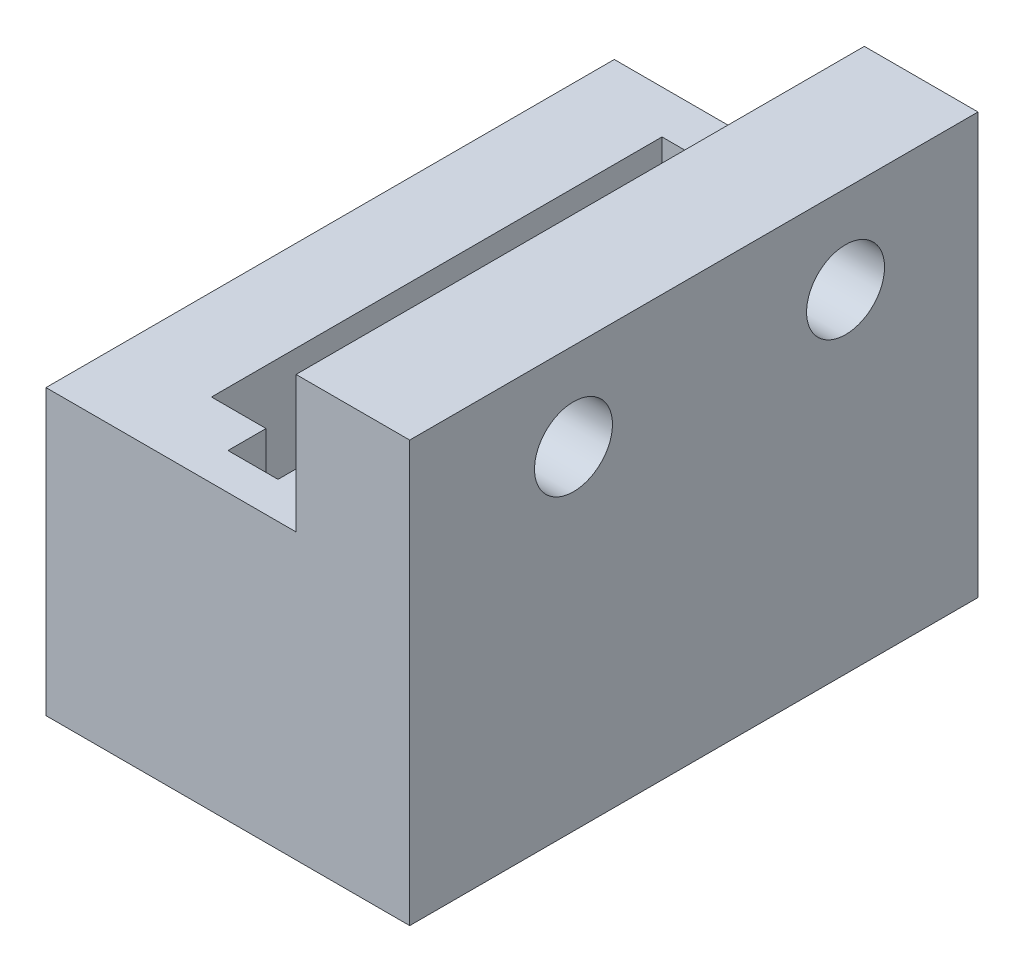
ISO-10303-21;
HEADER;
FILE_DESCRIPTION(('STEP AP214'),'2;1');
FILE_NAME('part.step','',(''),(''),'','','');
FILE_SCHEMA(('AUTOMOTIVE_DESIGN { 1 0 10303 214 1 1 1 1 }'));
ENDSEC;
DATA;
#1=APPLICATION_CONTEXT('core data for automotive mechanical design processes');
#2=APPLICATION_PROTOCOL_DEFINITION('international standard','automotive_design',2000,#1);
#3=PRODUCT_CONTEXT('',#1,'mechanical');
#4=PRODUCT('Part','Part','',(#3));
#5=PRODUCT_RELATED_PRODUCT_CATEGORY('part','',(#4));
#6=PRODUCT_DEFINITION_FORMATION('','',#4);
#7=PRODUCT_DEFINITION_CONTEXT('part definition',#1,'design');
#8=PRODUCT_DEFINITION('design','',#6,#7);
#9=PRODUCT_DEFINITION_SHAPE('','',#8);
#10=(LENGTH_UNIT() NAMED_UNIT(*) SI_UNIT(.MILLI.,.METRE.));
#11=(NAMED_UNIT(*) PLANE_ANGLE_UNIT() SI_UNIT($,.RADIAN.));
#12=(NAMED_UNIT(*) SI_UNIT($,.STERADIAN.) SOLID_ANGLE_UNIT());
#13=UNCERTAINTY_MEASURE_WITH_UNIT(LENGTH_MEASURE(1.E-05),#10,'distance_accuracy_value','');
#14=(GEOMETRIC_REPRESENTATION_CONTEXT(3) GLOBAL_UNCERTAINTY_ASSIGNED_CONTEXT((#13)) GLOBAL_UNIT_ASSIGNED_CONTEXT((#10,
#11,#12)) REPRESENTATION_CONTEXT('',''));
#15=CARTESIAN_POINT('',(0.,0.,0.));
#16=DIRECTION('',(0.,0.,1.));
#17=DIRECTION('',(1.,0.,0.));
#18=AXIS2_PLACEMENT_3D('',#15,#16,#17);
#19=CARTESIAN_POINT('',(0.,12.5,0.));
#20=DIRECTION('',(0.,-1.,0.));
#21=DIRECTION('',(0.,0.,-1.));
#22=AXIS2_PLACEMENT_3D('',#19,#20,#21);
#23=PLANE('',#22);
#24=DIRECTION('',(0.,0.,1.));
#25=VECTOR('',#24,1.);
#26=CARTESIAN_POINT('',(11.,12.5,0.));
#27=LINE('',#26,#25);
#28=CARTESIAN_POINT('',(11.,12.5,-25.));
#29=VERTEX_POINT('',#28);
#30=CARTESIAN_POINT('',(11.,12.5,-23.0982802043619));
#31=VERTEX_POINT('',#30);
#32=EDGE_CURVE('E49',#29,#31,#27,.T.);
#33=ORIENTED_EDGE('',*,*,#32,.F.);
#34=DIRECTION('',(-1.,0.,0.));
#35=VECTOR('',#34,1.);
#36=CARTESIAN_POINT('',(0.,12.5,-25.));
#37=LINE('',#36,#35);
#38=CARTESIAN_POINT('',(8.6,12.5,-25.));
#39=VERTEX_POINT('',#38);
#40=EDGE_CURVE('E290',#29,#39,#37,.T.);
#41=ORIENTED_EDGE('',*,*,#40,.T.);
#42=DIRECTION('',(0.,0.,-1.));
#43=VECTOR('',#42,1.);
#44=CARTESIAN_POINT('',(8.6,12.5,-25.));
#45=LINE('',#44,#43);
#46=CARTESIAN_POINT('',(8.6,12.5,-23.0982802043619));
#47=VERTEX_POINT('',#46);
#48=EDGE_CURVE('E250',#47,#39,#45,.T.);
#49=ORIENTED_EDGE('',*,*,#48,.F.);
#50=DIRECTION('',(-1.,0.,0.));
#51=VECTOR('',#50,1.);
#52=CARTESIAN_POINT('',(8.6,12.5,-23.0982802043619));
#53=LINE('',#52,#51);
#54=EDGE_CURVE('E247',#31,#47,#53,.T.);
#55=ORIENTED_EDGE('',*,*,#54,.F.);
#56=EDGE_LOOP('',(#33,#41,#49,#55));
#57=FACE_BOUND('',#56,.T.);
#58=ADVANCED_FACE('F39',(#57),#23,.F.);
#59=CARTESIAN_POINT('',(11.,12.5,-3.28028020436188));
#60=VERTEX_POINT('',#59);
#61=CARTESIAN_POINT('',(11.,12.5,0.));
#62=VERTEX_POINT('',#61);
#63=EDGE_CURVE('E11',#60,#62,#27,.T.);
#64=ORIENTED_EDGE('',*,*,#63,.F.);
#65=DIRECTION('',(1.,0.,0.));
#66=VECTOR('',#65,1.);
#67=CARTESIAN_POINT('',(8.6,12.5,-3.28028020436188));
#68=LINE('',#67,#66);
#69=CARTESIAN_POINT('',(8.6,12.5,-3.28028020436188));
#70=VERTEX_POINT('',#69);
#71=EDGE_CURVE('E244',#70,#60,#68,.T.);
#72=ORIENTED_EDGE('',*,*,#71,.F.);
#73=DIRECTION('',(0.,0.,-1.));
#74=VECTOR('',#73,1.);
#75=CARTESIAN_POINT('',(8.6,12.5,-1.60528020436188));
#76=LINE('',#75,#74);
#77=CARTESIAN_POINT('',(8.6,12.5,-1.60528020436188));
#78=VERTEX_POINT('',#77);
#79=EDGE_CURVE('E241',#78,#70,#76,.T.);
#80=ORIENTED_EDGE('',*,*,#79,.F.);
#81=DIRECTION('',(1.,0.,0.));
#82=VECTOR('',#81,1.);
#83=CARTESIAN_POINT('',(6.4,12.5,-1.60528020436188));
#84=LINE('',#83,#82);
#85=CARTESIAN_POINT('',(6.4,12.5,-1.60528020436188));
#86=VERTEX_POINT('',#85);
#87=EDGE_CURVE('E238',#86,#78,#84,.T.);
#88=ORIENTED_EDGE('',*,*,#87,.F.);
#89=DIRECTION('',(0.,0.,1.));
#90=VECTOR('',#89,1.);
#91=CARTESIAN_POINT('',(6.4,12.5,-3.28028020436188));
#92=LINE('',#91,#90);
#93=CARTESIAN_POINT('',(6.4,12.5,-3.28028020436188));
#94=VERTEX_POINT('',#93);
#95=EDGE_CURVE('E235',#94,#86,#92,.T.);
#96=ORIENTED_EDGE('',*,*,#95,.F.);
#97=DIRECTION('',(1.,0.,0.));
#98=VECTOR('',#97,1.);
#99=CARTESIAN_POINT('',(4.,12.5,-3.28028020436188));
#100=LINE('',#99,#98);
#101=CARTESIAN_POINT('',(4.,12.5,-3.28028020436188));
#102=VERTEX_POINT('',#101);
#103=EDGE_CURVE('E191',#102,#94,#100,.T.);
#104=ORIENTED_EDGE('',*,*,#103,.F.);
#105=DIRECTION('',(0.,0.,1.));
#106=VECTOR('',#105,1.);
#107=CARTESIAN_POINT('',(4.,12.5,-23.0982802043619));
#108=LINE('',#107,#106);
#109=CARTESIAN_POINT('',(4.,12.5,-23.0982802043619));
#110=VERTEX_POINT('',#109);
#111=EDGE_CURVE('E63',#110,#102,#108,.T.);
#112=ORIENTED_EDGE('',*,*,#111,.F.);
#113=DIRECTION('',(-1.,0.,0.));
#114=VECTOR('',#113,1.);
#115=CARTESIAN_POINT('',(4.,12.5,-23.0982802043619));
#116=LINE('',#115,#114);
#117=CARTESIAN_POINT('',(6.4,12.5,-23.0982802043619));
#118=VERTEX_POINT('',#117);
#119=EDGE_CURVE('E199',#118,#110,#116,.T.);
#120=ORIENTED_EDGE('',*,*,#119,.F.);
#121=DIRECTION('',(0.,0.,1.));
#122=VECTOR('',#121,1.);
#123=CARTESIAN_POINT('',(6.4,12.5,-23.0982802043619));
#124=LINE('',#123,#122);
#125=CARTESIAN_POINT('',(6.4,12.5,-25.));
#126=VERTEX_POINT('',#125);
#127=EDGE_CURVE('E253',#126,#118,#124,.T.);
#128=ORIENTED_EDGE('',*,*,#127,.F.);
#129=CARTESIAN_POINT('',(0.,12.5,-25.));
#130=VERTEX_POINT('',#129);
#131=EDGE_CURVE('E289',#126,#130,#37,.T.);
#132=ORIENTED_EDGE('',*,*,#131,.T.);
#133=DIRECTION('',(0.,0.,1.));
#134=VECTOR('',#133,1.);
#135=CARTESIAN_POINT('',(0.,12.5,0.));
#136=LINE('',#135,#134);
#137=CARTESIAN_POINT('',(0.,12.5,0.));
#138=VERTEX_POINT('',#137);
#139=EDGE_CURVE('E283',#130,#138,#136,.T.);
#140=ORIENTED_EDGE('',*,*,#139,.T.);
#141=DIRECTION('',(1.,0.,0.));
#142=VECTOR('',#141,1.);
#143=CARTESIAN_POINT('',(0.,12.5,0.));
#144=LINE('',#143,#142);
#145=EDGE_CURVE('E286',#138,#62,#144,.T.);
#146=ORIENTED_EDGE('',*,*,#145,.T.);
#147=EDGE_LOOP('',(#64,#72,#80,#88,#96,#104,#112,#120,#128,#132,#140,#146));
#148=FACE_BOUND('',#147,.T.);
#149=ADVANCED_FACE('F353',(#148),#23,.F.);
#150=CARTESIAN_POINT('',(0.,12.5,0.));
#151=DIRECTION('',(1.,0.,0.));
#152=DIRECTION('',(0.,0.,-1.));
#153=AXIS2_PLACEMENT_3D('',#150,#151,#152);
#154=PLANE('',#153);
#155=DIRECTION('',(0.,0.,1.));
#156=VECTOR('',#155,1.);
#157=CARTESIAN_POINT('',(0.,0.,0.));
#158=LINE('',#157,#156);
#159=CARTESIAN_POINT('',(0.,0.,-25.));
#160=VERTEX_POINT('',#159);
#161=CARTESIAN_POINT('',(0.,0.,0.));
#162=VERTEX_POINT('',#161);
#163=EDGE_CURVE('E260',#160,#162,#158,.T.);
#164=ORIENTED_EDGE('',*,*,#163,.T.);
#165=DIRECTION('',(0.,-1.,0.));
#166=VECTOR('',#165,1.);
#167=CARTESIAN_POINT('',(0.,12.5,0.));
#168=LINE('',#167,#166);
#169=EDGE_CURVE('E43',#138,#162,#168,.T.);
#170=ORIENTED_EDGE('',*,*,#169,.F.);
#171=ORIENTED_EDGE('',*,*,#139,.F.);
#172=DIRECTION('',(0.,-1.,0.));
#173=VECTOR('',#172,1.);
#174=CARTESIAN_POINT('',(0.,12.5,-25.));
#175=LINE('',#174,#173);
#176=EDGE_CURVE('E292',#130,#160,#175,.T.);
#177=ORIENTED_EDGE('',*,*,#176,.T.);
#178=EDGE_LOOP('',(#164,#170,#171,#177));
#179=FACE_BOUND('',#178,.T.);
#180=ADVANCED_FACE('F41',(#179),#154,.F.);
#181=CARTESIAN_POINT('',(0.,12.5,0.));
#182=DIRECTION('',(0.,0.,-1.));
#183=DIRECTION('',(-1.,0.,0.));
#184=AXIS2_PLACEMENT_3D('',#181,#182,#183);
#185=PLANE('',#184);
#186=DIRECTION('',(1.,0.,0.));
#187=VECTOR('',#186,1.);
#188=CARTESIAN_POINT('',(0.,0.,0.));
#189=LINE('',#188,#187);
#190=CARTESIAN_POINT('',(16.,0.,0.));
#191=VERTEX_POINT('',#190);
#192=EDGE_CURVE('E295',#162,#191,#189,.T.);
#193=ORIENTED_EDGE('',*,*,#192,.T.);
#194=DIRECTION('',(0.,-1.,0.));
#195=VECTOR('',#194,1.);
#196=CARTESIAN_POINT('',(16.,12.5,0.));
#197=LINE('',#196,#195);
#198=CARTESIAN_POINT('',(16.,18.5,0.));
#199=VERTEX_POINT('',#198);
#200=EDGE_CURVE('E172',#199,#191,#197,.T.);
#201=ORIENTED_EDGE('',*,*,#200,.F.);
#202=DIRECTION('',(1.,0.,0.));
#203=VECTOR('',#202,1.);
#204=CARTESIAN_POINT('',(11.,18.5,0.));
#205=LINE('',#204,#203);
#206=CARTESIAN_POINT('',(11.,18.5,0.));
#207=VERTEX_POINT('',#206);
#208=EDGE_CURVE('E166',#207,#199,#205,.T.);
#209=ORIENTED_EDGE('',*,*,#208,.F.);
#210=DIRECTION('',(0.,-1.,0.));
#211=VECTOR('',#210,1.);
#212=CARTESIAN_POINT('',(11.,18.5,0.));
#213=LINE('',#212,#211);
#214=EDGE_CURVE('E170',#207,#62,#213,.T.);
#215=ORIENTED_EDGE('',*,*,#214,.T.);
#216=ORIENTED_EDGE('',*,*,#145,.F.);
#217=ORIENTED_EDGE('',*,*,#169,.T.);
#218=EDGE_LOOP('',(#193,#201,#209,#215,#216,#217));
#219=FACE_BOUND('',#218,.T.);
#220=ADVANCED_FACE('F168',(#219),#185,.F.);
#221=CARTESIAN_POINT('',(16.,12.5,0.));
#222=DIRECTION('',(-1.,0.,0.));
#223=DIRECTION('',(0.,0.,1.));
#224=AXIS2_PLACEMENT_3D('',#221,#222,#223);
#225=PLANE('',#224);
#226=CARTESIAN_POINT('',(16.,14.644,-7.20528020436188));
#227=DIRECTION('',(1.,0.,0.));
#228=DIRECTION('',(0.,0.,-1.));
#229=AXIS2_PLACEMENT_3D('',#226,#227,#228);
#230=CIRCLE('',#229,1.7145);
#231=CARTESIAN_POINT('',(16.,14.644,-8.91978020436188));
#232=VERTEX_POINT('',#231);
#233=EDGE_CURVE('E323',#232,#232,#230,.T.);
#234=ORIENTED_EDGE('',*,*,#233,.F.);
#235=EDGE_LOOP('',(#234));
#236=FACE_BOUND('',#235,.T.);
#237=CARTESIAN_POINT('',(16.,14.644,-19.1732802043619));
#238=DIRECTION('',(1.,0.,0.));
#239=DIRECTION('',(0.,0.,-1.));
#240=AXIS2_PLACEMENT_3D('',#237,#238,#239);
#241=CIRCLE('',#240,1.7145);
#242=CARTESIAN_POINT('',(16.,14.644,-20.8877802043619));
#243=VERTEX_POINT('',#242);
#244=EDGE_CURVE('E328',#243,#243,#241,.T.);
#245=ORIENTED_EDGE('',*,*,#244,.F.);
#246=EDGE_LOOP('',(#245));
#247=FACE_BOUND('',#246,.T.);
#248=DIRECTION('',(0.,0.,-1.));
#249=VECTOR('',#248,1.);
#250=CARTESIAN_POINT('',(16.,0.,0.));
#251=LINE('',#250,#249);
#252=CARTESIAN_POINT('',(16.,0.,-25.));
#253=VERTEX_POINT('',#252);
#254=EDGE_CURVE('E297',#191,#253,#251,.T.);
#255=ORIENTED_EDGE('',*,*,#254,.T.);
#256=DIRECTION('',(0.,-1.,0.));
#257=VECTOR('',#256,1.);
#258=CARTESIAN_POINT('',(16.,12.5,-25.));
#259=LINE('',#258,#257);
#260=CARTESIAN_POINT('',(16.,18.5,-25.));
#261=VERTEX_POINT('',#260);
#262=EDGE_CURVE('E302',#261,#253,#259,.T.);
#263=ORIENTED_EDGE('',*,*,#262,.F.);
#264=DIRECTION('',(0.,0.,-1.));
#265=VECTOR('',#264,1.);
#266=CARTESIAN_POINT('',(16.,18.5,0.));
#267=LINE('',#266,#265);
#268=EDGE_CURVE('E176',#199,#261,#267,.T.);
#269=ORIENTED_EDGE('',*,*,#268,.F.);
#270=ORIENTED_EDGE('',*,*,#200,.T.);
#271=EDGE_LOOP('',(#255,#263,#269,#270));
#272=FACE_BOUND('',#271,.T.);
#273=ADVANCED_FACE('F315',(#236,#247,#272),#225,.F.);
#274=CARTESIAN_POINT('',(0.,12.5,-25.));
#275=DIRECTION('',(0.,0.,1.));
#276=DIRECTION('',(1.,0.,0.));
#277=AXIS2_PLACEMENT_3D('',#274,#275,#276);
#278=PLANE('',#277);
#279=ORIENTED_EDGE('',*,*,#131,.F.);
#280=DIRECTION('',(0.,1.,0.));
#281=VECTOR('',#280,1.);
#282=CARTESIAN_POINT('',(6.4,6.444,-25.));
#283=LINE('',#282,#281);
#284=CARTESIAN_POINT('',(6.4,6.444,-25.));
#285=VERTEX_POINT('',#284);
#286=EDGE_CURVE('E263',#285,#126,#283,.T.);
#287=ORIENTED_EDGE('',*,*,#286,.F.);
#288=DIRECTION('',(-1.,0.,0.));
#289=VECTOR('',#288,1.);
#290=CARTESIAN_POINT('',(6.4,6.444,-25.));
#291=LINE('',#290,#289);
#292=CARTESIAN_POINT('',(8.6,6.444,-25.));
#293=VERTEX_POINT('',#292);
#294=EDGE_CURVE('E223',#293,#285,#291,.T.);
#295=ORIENTED_EDGE('',*,*,#294,.F.);
#296=DIRECTION('',(0.,1.,0.));
#297=VECTOR('',#296,1.);
#298=CARTESIAN_POINT('',(8.6,6.444,-25.));
#299=LINE('',#298,#297);
#300=EDGE_CURVE('E265',#293,#39,#299,.T.);
#301=ORIENTED_EDGE('',*,*,#300,.T.);
#302=ORIENTED_EDGE('',*,*,#40,.F.);
#303=DIRECTION('',(0.,-1.,0.));
#304=VECTOR('',#303,1.);
#305=CARTESIAN_POINT('',(11.,18.5,-25.));
#306=LINE('',#305,#304);
#307=CARTESIAN_POINT('',(11.,18.5,-25.));
#308=VERTEX_POINT('',#307);
#309=EDGE_CURVE('E189',#308,#29,#306,.T.);
#310=ORIENTED_EDGE('',*,*,#309,.F.);
#311=DIRECTION('',(-1.,0.,0.));
#312=VECTOR('',#311,1.);
#313=CARTESIAN_POINT('',(11.,18.5,-25.));
#314=LINE('',#313,#312);
#315=EDGE_CURVE('E182',#261,#308,#314,.T.);
#316=ORIENTED_EDGE('',*,*,#315,.F.);
#317=ORIENTED_EDGE('',*,*,#262,.T.);
#318=DIRECTION('',(-1.,0.,0.));
#319=VECTOR('',#318,1.);
#320=CARTESIAN_POINT('',(0.,0.,-25.));
#321=LINE('',#320,#319);
#322=EDGE_CURVE('E287',#253,#160,#321,.T.);
#323=ORIENTED_EDGE('',*,*,#322,.T.);
#324=ORIENTED_EDGE('',*,*,#176,.F.);
#325=EDGE_LOOP('',(#279,#287,#295,#301,#302,#310,#316,#317,#323,#324));
#326=FACE_BOUND('',#325,.T.);
#327=ADVANCED_FACE('F318',(#326),#278,.F.);
#328=CARTESIAN_POINT('',(0.,0.,0.));
#329=DIRECTION('',(0.,-1.,0.));
#330=DIRECTION('',(0.,0.,-1.));
#331=AXIS2_PLACEMENT_3D('',#328,#329,#330);
#332=PLANE('',#331);
#333=ORIENTED_EDGE('',*,*,#163,.F.);
#334=ORIENTED_EDGE('',*,*,#322,.F.);
#335=ORIENTED_EDGE('',*,*,#254,.F.);
#336=ORIENTED_EDGE('',*,*,#192,.F.);
#337=EDGE_LOOP('',(#333,#334,#335,#336));
#338=FACE_BOUND('',#337,.T.);
#339=ADVANCED_FACE('F314',(#338),#332,.T.);
#340=CARTESIAN_POINT('',(4.,6.444,-23.0982802043619));
#341=DIRECTION('',(-1.,0.,0.));
#342=DIRECTION('',(0.,0.,1.));
#343=AXIS2_PLACEMENT_3D('',#340,#341,#342);
#344=PLANE('',#343);
#345=ORIENTED_EDGE('',*,*,#111,.T.);
#346=DIRECTION('',(0.,1.,0.));
#347=VECTOR('',#346,1.);
#348=CARTESIAN_POINT('',(4.,6.444,-3.28028020436188));
#349=LINE('',#348,#347);
#350=CARTESIAN_POINT('',(4.,6.444,-3.28028020436188));
#351=VERTEX_POINT('',#350);
#352=EDGE_CURVE('E231',#351,#102,#349,.T.);
#353=ORIENTED_EDGE('',*,*,#352,.F.);
#354=DIRECTION('',(0.,0.,1.));
#355=VECTOR('',#354,1.);
#356=CARTESIAN_POINT('',(4.,6.444,-23.0982802043619));
#357=LINE('',#356,#355);
#358=CARTESIAN_POINT('',(4.,6.444,-23.0982802043619));
#359=VERTEX_POINT('',#358);
#360=EDGE_CURVE('E195',#359,#351,#357,.T.);
#361=ORIENTED_EDGE('',*,*,#360,.F.);
#362=DIRECTION('',(0.,1.,0.));
#363=VECTOR('',#362,1.);
#364=CARTESIAN_POINT('',(4.,6.444,-23.0982802043619));
#365=LINE('',#364,#363);
#366=EDGE_CURVE('E258',#359,#110,#365,.T.);
#367=ORIENTED_EDGE('',*,*,#366,.T.);
#368=EDGE_LOOP('',(#345,#353,#361,#367));
#369=FACE_BOUND('',#368,.T.);
#370=ADVANCED_FACE('F362',(#369),#344,.F.);
#371=CARTESIAN_POINT('',(4.,6.444,-23.0982802043619));
#372=DIRECTION('',(0.,0.,-1.));
#373=DIRECTION('',(-1.,0.,0.));
#374=AXIS2_PLACEMENT_3D('',#371,#372,#373);
#375=PLANE('',#374);
#376=ORIENTED_EDGE('',*,*,#119,.T.);
#377=ORIENTED_EDGE('',*,*,#366,.F.);
#378=DIRECTION('',(-1.,0.,0.));
#379=VECTOR('',#378,1.);
#380=CARTESIAN_POINT('',(4.,6.444,-23.0982802043619));
#381=LINE('',#380,#379);
#382=CARTESIAN_POINT('',(6.4,6.444,-23.0982802043619));
#383=VERTEX_POINT('',#382);
#384=EDGE_CURVE('E229',#383,#359,#381,.T.);
#385=ORIENTED_EDGE('',*,*,#384,.F.);
#386=DIRECTION('',(0.,1.,0.));
#387=VECTOR('',#386,1.);
#388=CARTESIAN_POINT('',(6.4,6.444,-23.0982802043619));
#389=LINE('',#388,#387);
#390=EDGE_CURVE('E261',#383,#118,#389,.T.);
#391=ORIENTED_EDGE('',*,*,#390,.T.);
#392=EDGE_LOOP('',(#376,#377,#385,#391));
#393=FACE_BOUND('',#392,.T.);
#394=ADVANCED_FACE('F369',(#393),#375,.F.);
#395=CARTESIAN_POINT('',(6.4,6.444,-23.0982802043619));
#396=DIRECTION('',(-1.,0.,0.));
#397=DIRECTION('',(0.,0.,1.));
#398=AXIS2_PLACEMENT_3D('',#395,#396,#397);
#399=PLANE('',#398);
#400=ORIENTED_EDGE('',*,*,#127,.T.);
#401=ORIENTED_EDGE('',*,*,#390,.F.);
#402=DIRECTION('',(0.,0.,1.));
#403=VECTOR('',#402,1.);
#404=CARTESIAN_POINT('',(6.4,6.444,-23.0982802043619));
#405=LINE('',#404,#403);
#406=EDGE_CURVE('E226',#285,#383,#405,.T.);
#407=ORIENTED_EDGE('',*,*,#406,.F.);
#408=ORIENTED_EDGE('',*,*,#286,.T.);
#409=EDGE_LOOP('',(#400,#401,#407,#408));
#410=FACE_BOUND('',#409,.T.);
#411=ADVANCED_FACE('F373',(#410),#399,.F.);
#412=CARTESIAN_POINT('',(8.6,6.444,-25.));
#413=DIRECTION('',(1.,0.,0.));
#414=DIRECTION('',(0.,0.,-1.));
#415=AXIS2_PLACEMENT_3D('',#412,#413,#414);
#416=PLANE('',#415);
#417=ORIENTED_EDGE('',*,*,#48,.T.);
#418=ORIENTED_EDGE('',*,*,#300,.F.);
#419=DIRECTION('',(0.,0.,-1.));
#420=VECTOR('',#419,1.);
#421=CARTESIAN_POINT('',(8.6,6.444,-25.));
#422=LINE('',#421,#420);
#423=CARTESIAN_POINT('',(8.6,6.444,-23.0982802043619));
#424=VERTEX_POINT('',#423);
#425=EDGE_CURVE('E220',#424,#293,#422,.T.);
#426=ORIENTED_EDGE('',*,*,#425,.F.);
#427=DIRECTION('',(0.,1.,0.));
#428=VECTOR('',#427,1.);
#429=CARTESIAN_POINT('',(8.6,6.444,-23.0982802043619));
#430=LINE('',#429,#428);
#431=EDGE_CURVE('E268',#424,#47,#430,.T.);
#432=ORIENTED_EDGE('',*,*,#431,.T.);
#433=EDGE_LOOP('',(#417,#418,#426,#432));
#434=FACE_BOUND('',#433,.T.);
#435=ADVANCED_FACE('F379',(#434),#416,.F.);
#436=CARTESIAN_POINT('',(8.6,6.444,-23.0982802043619));
#437=DIRECTION('',(0.,0.,-1.));
#438=DIRECTION('',(-1.,0.,0.));
#439=AXIS2_PLACEMENT_3D('',#436,#437,#438);
#440=PLANE('',#439);
#441=ORIENTED_EDGE('',*,*,#54,.T.);
#442=ORIENTED_EDGE('',*,*,#431,.F.);
#443=DIRECTION('',(-1.,0.,0.));
#444=VECTOR('',#443,1.);
#445=CARTESIAN_POINT('',(8.6,6.444,-23.0982802043619));
#446=LINE('',#445,#444);
#447=CARTESIAN_POINT('',(11.,6.444,-23.0982802043619));
#448=VERTEX_POINT('',#447);
#449=EDGE_CURVE('E217',#448,#424,#446,.T.);
#450=ORIENTED_EDGE('',*,*,#449,.F.);
#451=DIRECTION('',(0.,1.,0.));
#452=VECTOR('',#451,1.);
#453=CARTESIAN_POINT('',(11.,6.444,-23.0982802043619));
#454=LINE('',#453,#452);
#455=EDGE_CURVE('E270',#448,#31,#454,.T.);
#456=ORIENTED_EDGE('',*,*,#455,.T.);
#457=EDGE_LOOP('',(#441,#442,#450,#456));
#458=FACE_BOUND('',#457,.T.);
#459=ADVANCED_FACE('F388',(#458),#440,.F.);
#460=CARTESIAN_POINT('',(11.,6.444,-23.0982802043619));
#461=DIRECTION('',(1.,0.,0.));
#462=DIRECTION('',(0.,0.,-1.));
#463=AXIS2_PLACEMENT_3D('',#460,#461,#462);
#464=PLANE('',#463);
#465=CARTESIAN_POINT('',(11.,14.644,-7.20528020436188));
#466=DIRECTION('',(1.,0.,0.));
#467=DIRECTION('',(0.,0.,-1.));
#468=AXIS2_PLACEMENT_3D('',#465,#466,#467);
#469=CIRCLE('',#468,1.7145);
#470=CARTESIAN_POINT('',(11.,14.644,-8.91978020436188));
#471=VERTEX_POINT('',#470);
#472=EDGE_CURVE('E321',#471,#471,#469,.F.);
#473=ORIENTED_EDGE('',*,*,#472,.F.);
#474=EDGE_LOOP('',(#473));
#475=FACE_BOUND('',#474,.T.);
#476=CARTESIAN_POINT('',(11.,14.644,-19.1732802043619));
#477=DIRECTION('',(1.,0.,0.));
#478=DIRECTION('',(0.,0.,-1.));
#479=AXIS2_PLACEMENT_3D('',#476,#477,#478);
#480=CIRCLE('',#479,1.7145);
#481=CARTESIAN_POINT('',(11.,14.644,-20.8877802043619));
#482=VERTEX_POINT('',#481);
#483=EDGE_CURVE('E332',#482,#482,#480,.F.);
#484=ORIENTED_EDGE('',*,*,#483,.F.);
#485=EDGE_LOOP('',(#484));
#486=FACE_BOUND('',#485,.T.);
#487=DIRECTION('',(0.,1.,0.));
#488=VECTOR('',#487,1.);
#489=CARTESIAN_POINT('',(11.,6.444,-3.28028020436188));
#490=LINE('',#489,#488);
#491=CARTESIAN_POINT('',(11.,6.444,-3.28028020436188));
#492=VERTEX_POINT('',#491);
#493=EDGE_CURVE('E272',#492,#60,#490,.T.);
#494=ORIENTED_EDGE('',*,*,#493,.T.);
#495=ORIENTED_EDGE('',*,*,#63,.T.);
#496=ORIENTED_EDGE('',*,*,#214,.F.);
#497=DIRECTION('',(0.,0.,1.));
#498=VECTOR('',#497,1.);
#499=CARTESIAN_POINT('',(11.,18.5,0.));
#500=LINE('',#499,#498);
#501=EDGE_CURVE('E177',#308,#207,#500,.T.);
#502=ORIENTED_EDGE('',*,*,#501,.F.);
#503=ORIENTED_EDGE('',*,*,#309,.T.);
#504=ORIENTED_EDGE('',*,*,#32,.T.);
#505=ORIENTED_EDGE('',*,*,#455,.F.);
#506=DIRECTION('',(0.,0.,-1.));
#507=VECTOR('',#506,1.);
#508=CARTESIAN_POINT('',(11.,6.444,-23.0982802043619));
#509=LINE('',#508,#507);
#510=EDGE_CURVE('E214',#492,#448,#509,.T.);
#511=ORIENTED_EDGE('',*,*,#510,.F.);
#512=EDGE_LOOP('',(#494,#495,#496,#502,#503,#504,#505,#511));
#513=FACE_BOUND('',#512,.T.);
#514=ADVANCED_FACE('F188',(#475,#486,#513),#464,.F.);
#515=CARTESIAN_POINT('',(8.6,6.444,-3.28028020436188));
#516=DIRECTION('',(0.,0.,1.));
#517=DIRECTION('',(1.,0.,0.));
#518=AXIS2_PLACEMENT_3D('',#515,#516,#517);
#519=PLANE('',#518);
#520=ORIENTED_EDGE('',*,*,#71,.T.);
#521=ORIENTED_EDGE('',*,*,#493,.F.);
#522=DIRECTION('',(1.,0.,0.));
#523=VECTOR('',#522,1.);
#524=CARTESIAN_POINT('',(8.6,6.444,-3.28028020436188));
#525=LINE('',#524,#523);
#526=CARTESIAN_POINT('',(8.6,6.444,-3.28028020436188));
#527=VERTEX_POINT('',#526);
#528=EDGE_CURVE('E211',#527,#492,#525,.T.);
#529=ORIENTED_EDGE('',*,*,#528,.F.);
#530=DIRECTION('',(0.,1.,0.));
#531=VECTOR('',#530,1.);
#532=CARTESIAN_POINT('',(8.6,6.444,-3.28028020436188));
#533=LINE('',#532,#531);
#534=EDGE_CURVE('E274',#527,#70,#533,.T.);
#535=ORIENTED_EDGE('',*,*,#534,.T.);
#536=EDGE_LOOP('',(#520,#521,#529,#535));
#537=FACE_BOUND('',#536,.T.);
#538=ADVANCED_FACE('F394',(#537),#519,.F.);
#539=CARTESIAN_POINT('',(8.6,6.444,-1.60528020436188));
#540=DIRECTION('',(1.,0.,0.));
#541=DIRECTION('',(0.,0.,-1.));
#542=AXIS2_PLACEMENT_3D('',#539,#540,#541);
#543=PLANE('',#542);
#544=ORIENTED_EDGE('',*,*,#79,.T.);
#545=ORIENTED_EDGE('',*,*,#534,.F.);
#546=DIRECTION('',(0.,0.,-1.));
#547=VECTOR('',#546,1.);
#548=CARTESIAN_POINT('',(8.6,6.444,-1.60528020436188));
#549=LINE('',#548,#547);
#550=CARTESIAN_POINT('',(8.6,6.444,-1.60528020436188));
#551=VERTEX_POINT('',#550);
#552=EDGE_CURVE('E208',#551,#527,#549,.T.);
#553=ORIENTED_EDGE('',*,*,#552,.F.);
#554=DIRECTION('',(0.,1.,0.));
#555=VECTOR('',#554,1.);
#556=CARTESIAN_POINT('',(8.6,6.444,-1.60528020436188));
#557=LINE('',#556,#555);
#558=EDGE_CURVE('E276',#551,#78,#557,.T.);
#559=ORIENTED_EDGE('',*,*,#558,.T.);
#560=EDGE_LOOP('',(#544,#545,#553,#559));
#561=FACE_BOUND('',#560,.T.);
#562=ADVANCED_FACE('F398',(#561),#543,.F.);
#563=CARTESIAN_POINT('',(6.4,6.444,-1.60528020436188));
#564=DIRECTION('',(0.,0.,1.));
#565=DIRECTION('',(1.,0.,0.));
#566=AXIS2_PLACEMENT_3D('',#563,#564,#565);
#567=PLANE('',#566);
#568=ORIENTED_EDGE('',*,*,#87,.T.);
#569=ORIENTED_EDGE('',*,*,#558,.F.);
#570=DIRECTION('',(1.,0.,0.));
#571=VECTOR('',#570,1.);
#572=CARTESIAN_POINT('',(6.4,6.444,-1.60528020436188));
#573=LINE('',#572,#571);
#574=CARTESIAN_POINT('',(6.4,6.444,-1.60528020436188));
#575=VERTEX_POINT('',#574);
#576=EDGE_CURVE('E205',#575,#551,#573,.T.);
#577=ORIENTED_EDGE('',*,*,#576,.F.);
#578=DIRECTION('',(0.,1.,0.));
#579=VECTOR('',#578,1.);
#580=CARTESIAN_POINT('',(6.4,6.444,-1.60528020436188));
#581=LINE('',#580,#579);
#582=EDGE_CURVE('E278',#575,#86,#581,.T.);
#583=ORIENTED_EDGE('',*,*,#582,.T.);
#584=EDGE_LOOP('',(#568,#569,#577,#583));
#585=FACE_BOUND('',#584,.T.);
#586=ADVANCED_FACE('F402',(#585),#567,.F.);
#587=CARTESIAN_POINT('',(6.4,6.444,-3.28028020436188));
#588=DIRECTION('',(-1.,0.,0.));
#589=DIRECTION('',(0.,0.,1.));
#590=AXIS2_PLACEMENT_3D('',#587,#588,#589);
#591=PLANE('',#590);
#592=ORIENTED_EDGE('',*,*,#95,.T.);
#593=ORIENTED_EDGE('',*,*,#582,.F.);
#594=DIRECTION('',(0.,0.,1.));
#595=VECTOR('',#594,1.);
#596=CARTESIAN_POINT('',(6.4,6.444,-3.28028020436188));
#597=LINE('',#596,#595);
#598=CARTESIAN_POINT('',(6.4,6.444,-3.28028020436188));
#599=VERTEX_POINT('',#598);
#600=EDGE_CURVE('E202',#599,#575,#597,.T.);
#601=ORIENTED_EDGE('',*,*,#600,.F.);
#602=DIRECTION('',(0.,1.,0.));
#603=VECTOR('',#602,1.);
#604=CARTESIAN_POINT('',(6.4,6.444,-3.28028020436188));
#605=LINE('',#604,#603);
#606=EDGE_CURVE('E280',#599,#94,#605,.T.);
#607=ORIENTED_EDGE('',*,*,#606,.T.);
#608=EDGE_LOOP('',(#592,#593,#601,#607));
#609=FACE_BOUND('',#608,.T.);
#610=ADVANCED_FACE('F406',(#609),#591,.F.);
#611=CARTESIAN_POINT('',(4.,6.444,-3.28028020436188));
#612=DIRECTION('',(0.,0.,1.));
#613=DIRECTION('',(1.,0.,0.));
#614=AXIS2_PLACEMENT_3D('',#611,#612,#613);
#615=PLANE('',#614);
#616=ORIENTED_EDGE('',*,*,#103,.T.);
#617=ORIENTED_EDGE('',*,*,#606,.F.);
#618=DIRECTION('',(1.,0.,0.));
#619=VECTOR('',#618,1.);
#620=CARTESIAN_POINT('',(4.,6.444,-3.28028020436188));
#621=LINE('',#620,#619);
#622=EDGE_CURVE('E198',#351,#599,#621,.T.);
#623=ORIENTED_EDGE('',*,*,#622,.F.);
#624=ORIENTED_EDGE('',*,*,#352,.T.);
#625=EDGE_LOOP('',(#616,#617,#623,#624));
#626=FACE_BOUND('',#625,.T.);
#627=ADVANCED_FACE('F409',(#626),#615,.F.);
#628=CARTESIAN_POINT('',(0.,6.444,0.));
#629=DIRECTION('',(0.,1.,0.));
#630=DIRECTION('',(0.,0.,1.));
#631=AXIS2_PLACEMENT_3D('',#628,#629,#630);
#632=PLANE('',#631);
#633=CARTESIAN_POINT('',(7.5,6.444,-21.6052802043619));
#634=DIRECTION('',(0.,1.,0.));
#635=DIRECTION('',(0.,0.,1.));
#636=AXIS2_PLACEMENT_3D('',#633,#634,#635);
#637=CIRCLE('',#636,1.5);
#638=CARTESIAN_POINT('',(7.5,6.444,-20.1052802043619));
#639=VERTEX_POINT('',#638);
#640=EDGE_CURVE('E444',#639,#639,#637,.T.);
#641=ORIENTED_EDGE('',*,*,#640,.F.);
#642=EDGE_LOOP('',(#641));
#643=FACE_BOUND('',#642,.T.);
#644=CARTESIAN_POINT('',(7.50000000000001,6.444,-13.6052802043619));
#645=DIRECTION('',(0.,1.,0.));
#646=DIRECTION('',(0.,0.,1.));
#647=AXIS2_PLACEMENT_3D('',#644,#645,#646);
#648=CIRCLE('',#647,1.5);
#649=CARTESIAN_POINT('',(7.50000000000001,6.444,-12.1052802043619));
#650=VERTEX_POINT('',#649);
#651=EDGE_CURVE('E448',#650,#650,#648,.T.);
#652=ORIENTED_EDGE('',*,*,#651,.F.);
#653=EDGE_LOOP('',(#652));
#654=FACE_BOUND('',#653,.T.);
#655=CARTESIAN_POINT('',(7.5,6.444,-5.60528020436188));
#656=DIRECTION('',(0.,1.,0.));
#657=DIRECTION('',(0.,0.,1.));
#658=AXIS2_PLACEMENT_3D('',#655,#656,#657);
#659=CIRCLE('',#658,1.5);
#660=CARTESIAN_POINT('',(7.5,6.444,-4.10528020436188));
#661=VERTEX_POINT('',#660);
#662=EDGE_CURVE('E452',#661,#661,#659,.T.);
#663=ORIENTED_EDGE('',*,*,#662,.F.);
#664=EDGE_LOOP('',(#663));
#665=FACE_BOUND('',#664,.T.);
#666=CARTESIAN_POINT('',(9.12500000000001,6.444,-9.60528020436188));
#667=DIRECTION('',(0.,1.,0.));
#668=DIRECTION('',(0.,0.,1.));
#669=AXIS2_PLACEMENT_3D('',#666,#667,#668);
#670=CIRCLE('',#669,0.500000000000001);
#671=CARTESIAN_POINT('',(9.12500000000001,6.444,-9.10528020436188));
#672=VERTEX_POINT('',#671);
#673=EDGE_CURVE('E456',#672,#672,#670,.T.);
#674=ORIENTED_EDGE('',*,*,#673,.F.);
#675=EDGE_LOOP('',(#674));
#676=FACE_BOUND('',#675,.T.);
#677=CARTESIAN_POINT('',(5.875,6.444,-17.6052802043619));
#678=DIRECTION('',(0.,1.,0.));
#679=DIRECTION('',(0.,0.,1.));
#680=AXIS2_PLACEMENT_3D('',#677,#678,#679);
#681=CIRCLE('',#680,0.500000000000001);
#682=CARTESIAN_POINT('',(5.875,6.444,-17.1052802043619));
#683=VERTEX_POINT('',#682);
#684=EDGE_CURVE('E460',#683,#683,#681,.T.);
#685=ORIENTED_EDGE('',*,*,#684,.F.);
#686=EDGE_LOOP('',(#685));
#687=FACE_BOUND('',#686,.T.);
#688=CARTESIAN_POINT('',(9.12500000000001,6.444,-17.6052802043619));
#689=DIRECTION('',(0.,1.,0.));
#690=DIRECTION('',(0.,0.,1.));
#691=AXIS2_PLACEMENT_3D('',#688,#689,#690);
#692=CIRCLE('',#691,0.500000000000001);
#693=CARTESIAN_POINT('',(9.12500000000001,6.444,-17.1052802043619));
#694=VERTEX_POINT('',#693);
#695=EDGE_CURVE('E464',#694,#694,#692,.T.);
#696=ORIENTED_EDGE('',*,*,#695,.F.);
#697=EDGE_LOOP('',(#696));
#698=FACE_BOUND('',#697,.T.);
#699=CARTESIAN_POINT('',(5.875,6.444,-9.60528020436188));
#700=DIRECTION('',(0.,1.,0.));
#701=DIRECTION('',(0.,0.,1.));
#702=AXIS2_PLACEMENT_3D('',#699,#700,#701);
#703=CIRCLE('',#702,0.500000000000002);
#704=CARTESIAN_POINT('',(5.875,6.444,-9.10528020436188));
#705=VERTEX_POINT('',#704);
#706=EDGE_CURVE('E467',#705,#705,#703,.T.);
#707=ORIENTED_EDGE('',*,*,#706,.F.);
#708=EDGE_LOOP('',(#707));
#709=FACE_BOUND('',#708,.T.);
#710=ORIENTED_EDGE('',*,*,#360,.T.);
#711=ORIENTED_EDGE('',*,*,#622,.T.);
#712=ORIENTED_EDGE('',*,*,#600,.T.);
#713=ORIENTED_EDGE('',*,*,#576,.T.);
#714=ORIENTED_EDGE('',*,*,#552,.T.);
#715=ORIENTED_EDGE('',*,*,#528,.T.);
#716=ORIENTED_EDGE('',*,*,#510,.T.);
#717=ORIENTED_EDGE('',*,*,#449,.T.);
#718=ORIENTED_EDGE('',*,*,#425,.T.);
#719=ORIENTED_EDGE('',*,*,#294,.T.);
#720=ORIENTED_EDGE('',*,*,#406,.T.);
#721=ORIENTED_EDGE('',*,*,#384,.T.);
#722=EDGE_LOOP('',(#710,#711,#712,#713,#714,#715,#716,#717,#718,#719,#720,#721));
#723=FACE_BOUND('',#722,.T.);
#724=ADVANCED_FACE('F383',(#643,#654,#665,#676,#687,#698,#709,#723),#632,.T.);
#725=CARTESIAN_POINT('',(0.,18.5,0.));
#726=DIRECTION('',(0.,-1.,0.));
#727=DIRECTION('',(0.,0.,-1.));
#728=AXIS2_PLACEMENT_3D('',#725,#726,#727);
#729=PLANE('',#728);
#730=ORIENTED_EDGE('',*,*,#501,.T.);
#731=ORIENTED_EDGE('',*,*,#208,.T.);
#732=ORIENTED_EDGE('',*,*,#268,.T.);
#733=ORIENTED_EDGE('',*,*,#315,.T.);
#734=EDGE_LOOP('',(#730,#731,#732,#733));
#735=FACE_BOUND('',#734,.T.);
#736=ADVANCED_FACE('F180',(#735),#729,.F.);
#737=CARTESIAN_POINT('',(6.15066169462266,14.644,-19.1732802043619));
#738=DIRECTION('',(1.,0.,0.));
#739=DIRECTION('',(0.,0.,-1.));
#740=AXIS2_PLACEMENT_3D('',#737,#738,#739);
#741=CYLINDRICAL_SURFACE('',#740,1.7145);
#742=ORIENTED_EDGE('',*,*,#483,.T.);
#743=EDGE_LOOP('',(#742));
#744=FACE_BOUND('',#743,.T.);
#745=ORIENTED_EDGE('',*,*,#244,.T.);
#746=EDGE_LOOP('',(#745));
#747=FACE_BOUND('',#746,.T.);
#748=ADVANCED_FACE('F339',(#744,#747),#741,.F.);
#749=CARTESIAN_POINT('',(6.15066169462266,14.644,-7.20528020436188));
#750=DIRECTION('',(1.,0.,0.));
#751=DIRECTION('',(0.,0.,-1.));
#752=AXIS2_PLACEMENT_3D('',#749,#750,#751);
#753=CYLINDRICAL_SURFACE('',#752,1.7145);
#754=ORIENTED_EDGE('',*,*,#472,.T.);
#755=EDGE_LOOP('',(#754));
#756=FACE_BOUND('',#755,.T.);
#757=ORIENTED_EDGE('',*,*,#233,.T.);
#758=EDGE_LOOP('',(#757));
#759=FACE_BOUND('',#758,.T.);
#760=ADVANCED_FACE('F553',(#756,#759),#753,.F.);
#761=CARTESIAN_POINT('',(5.875,2.444,-9.60528020436188));
#762=DIRECTION('',(0.,1.,0.));
#763=DIRECTION('',(0.,0.,1.));
#764=AXIS2_PLACEMENT_3D('',#761,#762,#763);
#765=CYLINDRICAL_SURFACE('',#764,0.500000000000002);
#766=CARTESIAN_POINT('',(5.875,2.444,-9.60528020436188));
#767=DIRECTION('',(0.,1.,0.));
#768=DIRECTION('',(0.,0.,1.));
#769=AXIS2_PLACEMENT_3D('',#766,#767,#768);
#770=CIRCLE('',#769,0.500000000000002);
#771=CARTESIAN_POINT('',(5.875,2.444,-9.10528020436188));
#772=VERTEX_POINT('',#771);
#773=EDGE_CURVE('E335',#772,#772,#770,.T.);
#774=ORIENTED_EDGE('',*,*,#773,.F.);
#775=EDGE_LOOP('',(#774));
#776=FACE_BOUND('',#775,.T.);
#777=ORIENTED_EDGE('',*,*,#706,.T.);
#778=EDGE_LOOP('',(#777));
#779=FACE_BOUND('',#778,.T.);
#780=ADVANCED_FACE('F549',(#776,#779),#765,.F.);
#781=CARTESIAN_POINT('',(5.875,2.444,-9.60528020436188));
#782=DIRECTION('',(0.,1.,0.));
#783=DIRECTION('',(0.,0.,1.));
#784=AXIS2_PLACEMENT_3D('',#781,#782,#783);
#785=PLANE('',#784);
#786=ORIENTED_EDGE('',*,*,#773,.T.);
#787=EDGE_LOOP('',(#786));
#788=FACE_BOUND('',#787,.T.);
#789=ADVANCED_FACE('F528',(#788),#785,.T.);
#790=CARTESIAN_POINT('',(9.12500000000001,2.444,-17.6052802043619));
#791=DIRECTION('',(0.,1.,0.));
#792=DIRECTION('',(0.,0.,1.));
#793=AXIS2_PLACEMENT_3D('',#790,#791,#792);
#794=CYLINDRICAL_SURFACE('',#793,0.500000000000001);
#795=CARTESIAN_POINT('',(9.12500000000001,2.444,-17.6052802043619));
#796=DIRECTION('',(0.,1.,0.));
#797=DIRECTION('',(0.,0.,1.));
#798=AXIS2_PLACEMENT_3D('',#795,#796,#797);
#799=CIRCLE('',#798,0.500000000000001);
#800=CARTESIAN_POINT('',(9.12500000000001,2.444,-17.1052802043619));
#801=VERTEX_POINT('',#800);
#802=EDGE_CURVE('E480',#801,#801,#799,.T.);
#803=ORIENTED_EDGE('',*,*,#802,.F.);
#804=EDGE_LOOP('',(#803));
#805=FACE_BOUND('',#804,.T.);
#806=ORIENTED_EDGE('',*,*,#695,.T.);
#807=EDGE_LOOP('',(#806));
#808=FACE_BOUND('',#807,.T.);
#809=ADVANCED_FACE('F524',(#805,#808),#794,.F.);
#810=CARTESIAN_POINT('',(9.12500000000001,2.444,-17.6052802043619));
#811=DIRECTION('',(0.,1.,0.));
#812=DIRECTION('',(0.,0.,1.));
#813=AXIS2_PLACEMENT_3D('',#810,#811,#812);
#814=PLANE('',#813);
#815=ORIENTED_EDGE('',*,*,#802,.T.);
#816=EDGE_LOOP('',(#815));
#817=FACE_BOUND('',#816,.T.);
#818=ADVANCED_FACE('F527',(#817),#814,.T.);
#819=CARTESIAN_POINT('',(5.875,2.444,-17.6052802043619));
#820=DIRECTION('',(0.,1.,0.));
#821=DIRECTION('',(0.,0.,1.));
#822=AXIS2_PLACEMENT_3D('',#819,#820,#821);
#823=CYLINDRICAL_SURFACE('',#822,0.500000000000001);
#824=CARTESIAN_POINT('',(5.875,2.444,-17.6052802043619));
#825=DIRECTION('',(0.,1.,0.));
#826=DIRECTION('',(0.,0.,1.));
#827=AXIS2_PLACEMENT_3D('',#824,#825,#826);
#828=CIRCLE('',#827,0.500000000000001);
#829=CARTESIAN_POINT('',(5.875,2.444,-17.1052802043619));
#830=VERTEX_POINT('',#829);
#831=EDGE_CURVE('E474',#830,#830,#828,.T.);
#832=ORIENTED_EDGE('',*,*,#831,.F.);
#833=EDGE_LOOP('',(#832));
#834=FACE_BOUND('',#833,.T.);
#835=ORIENTED_EDGE('',*,*,#684,.T.);
#836=EDGE_LOOP('',(#835));
#837=FACE_BOUND('',#836,.T.);
#838=ADVANCED_FACE('F532',(#834,#837),#823,.F.);
#839=CARTESIAN_POINT('',(5.875,2.444,-17.6052802043619));
#840=DIRECTION('',(0.,1.,0.));
#841=DIRECTION('',(0.,0.,1.));
#842=AXIS2_PLACEMENT_3D('',#839,#840,#841);
#843=PLANE('',#842);
#844=ORIENTED_EDGE('',*,*,#831,.T.);
#845=EDGE_LOOP('',(#844));
#846=FACE_BOUND('',#845,.T.);
#847=ADVANCED_FACE('F537',(#846),#843,.T.);
#848=CARTESIAN_POINT('',(9.12500000000001,2.444,-9.60528020436188));
#849=DIRECTION('',(0.,1.,0.));
#850=DIRECTION('',(0.,0.,1.));
#851=AXIS2_PLACEMENT_3D('',#848,#849,#850);
#852=CYLINDRICAL_SURFACE('',#851,0.500000000000001);
#853=CARTESIAN_POINT('',(9.12500000000001,2.444,-9.60528020436188));
#854=DIRECTION('',(0.,1.,0.));
#855=DIRECTION('',(0.,0.,1.));
#856=AXIS2_PLACEMENT_3D('',#853,#854,#855);
#857=CIRCLE('',#856,0.500000000000001);
#858=CARTESIAN_POINT('',(9.12500000000001,2.444,-9.10528020436188));
#859=VERTEX_POINT('',#858);
#860=EDGE_CURVE('E471',#859,#859,#857,.T.);
#861=ORIENTED_EDGE('',*,*,#860,.F.);
#862=EDGE_LOOP('',(#861));
#863=FACE_BOUND('',#862,.T.);
#864=ORIENTED_EDGE('',*,*,#673,.T.);
#865=EDGE_LOOP('',(#864));
#866=FACE_BOUND('',#865,.T.);
#867=ADVANCED_FACE('F534',(#863,#866),#852,.F.);
#868=CARTESIAN_POINT('',(9.12500000000001,2.444,-9.60528020436188));
#869=DIRECTION('',(0.,1.,0.));
#870=DIRECTION('',(0.,0.,1.));
#871=AXIS2_PLACEMENT_3D('',#868,#869,#870);
#872=PLANE('',#871);
#873=ORIENTED_EDGE('',*,*,#860,.T.);
#874=EDGE_LOOP('',(#873));
#875=FACE_BOUND('',#874,.T.);
#876=ADVANCED_FACE('F519',(#875),#872,.T.);
#877=CARTESIAN_POINT('',(7.5,4.444,-5.60528020436188));
#878=DIRECTION('',(0.,1.,0.));
#879=DIRECTION('',(0.,0.,1.));
#880=AXIS2_PLACEMENT_3D('',#877,#878,#879);
#881=CYLINDRICAL_SURFACE('',#880,1.5);
#882=CARTESIAN_POINT('',(7.5,4.444,-5.60528020436188));
#883=DIRECTION('',(0.,1.,0.));
#884=DIRECTION('',(0.,0.,1.));
#885=AXIS2_PLACEMENT_3D('',#882,#883,#884);
#886=CIRCLE('',#885,1.5);
#887=CARTESIAN_POINT('',(7.5,4.444,-4.10528020436188));
#888=VERTEX_POINT('',#887);
#889=EDGE_CURVE('E485',#888,#888,#886,.T.);
#890=ORIENTED_EDGE('',*,*,#889,.F.);
#891=EDGE_LOOP('',(#890));
#892=FACE_BOUND('',#891,.T.);
#893=ORIENTED_EDGE('',*,*,#662,.T.);
#894=EDGE_LOOP('',(#893));
#895=FACE_BOUND('',#894,.T.);
#896=ADVANCED_FACE('F517',(#892,#895),#881,.F.);
#897=CARTESIAN_POINT('',(7.5,4.444,-5.60528020436188));
#898=DIRECTION('',(0.,1.,0.));
#899=DIRECTION('',(0.,0.,1.));
#900=AXIS2_PLACEMENT_3D('',#897,#898,#899);
#901=PLANE('',#900);
#902=ORIENTED_EDGE('',*,*,#889,.T.);
#903=EDGE_LOOP('',(#902));
#904=FACE_BOUND('',#903,.T.);
#905=ADVANCED_FACE('F514',(#904),#901,.T.);
#906=CARTESIAN_POINT('',(7.50000000000001,4.444,-13.6052802043619));
#907=DIRECTION('',(0.,1.,0.));
#908=DIRECTION('',(0.,0.,1.));
#909=AXIS2_PLACEMENT_3D('',#906,#907,#908);
#910=CYLINDRICAL_SURFACE('',#909,1.5);
#911=CARTESIAN_POINT('',(7.50000000000001,4.444,-13.6052802043619));
#912=DIRECTION('',(0.,1.,0.));
#913=DIRECTION('',(0.,0.,1.));
#914=AXIS2_PLACEMENT_3D('',#911,#912,#913);
#915=CIRCLE('',#914,1.5);
#916=CARTESIAN_POINT('',(7.50000000000001,4.444,-12.1052802043619));
#917=VERTEX_POINT('',#916);
#918=EDGE_CURVE('E489',#917,#917,#915,.T.);
#919=ORIENTED_EDGE('',*,*,#918,.F.);
#920=EDGE_LOOP('',(#919));
#921=FACE_BOUND('',#920,.T.);
#922=ORIENTED_EDGE('',*,*,#651,.T.);
#923=EDGE_LOOP('',(#922));
#924=FACE_BOUND('',#923,.T.);
#925=ADVANCED_FACE('F509',(#921,#924),#910,.F.);
#926=CARTESIAN_POINT('',(7.50000000000001,4.444,-13.6052802043619));
#927=DIRECTION('',(0.,1.,0.));
#928=DIRECTION('',(0.,0.,1.));
#929=AXIS2_PLACEMENT_3D('',#926,#927,#928);
#930=PLANE('',#929);
#931=ORIENTED_EDGE('',*,*,#918,.T.);
#932=EDGE_LOOP('',(#931));
#933=FACE_BOUND('',#932,.T.);
#934=ADVANCED_FACE('F502',(#933),#930,.T.);
#935=CARTESIAN_POINT('',(7.5,4.444,-21.6052802043619));
#936=DIRECTION('',(0.,1.,0.));
#937=DIRECTION('',(0.,0.,1.));
#938=AXIS2_PLACEMENT_3D('',#935,#936,#937);
#939=CYLINDRICAL_SURFACE('',#938,1.5);
#940=CARTESIAN_POINT('',(7.5,4.444,-21.6052802043619));
#941=DIRECTION('',(0.,1.,0.));
#942=DIRECTION('',(0.,0.,1.));
#943=AXIS2_PLACEMENT_3D('',#940,#941,#942);
#944=CIRCLE('',#943,1.5);
#945=CARTESIAN_POINT('',(7.5,4.444,-20.1052802043619));
#946=VERTEX_POINT('',#945);
#947=EDGE_CURVE('E483',#946,#946,#944,.T.);
#948=ORIENTED_EDGE('',*,*,#947,.F.);
#949=EDGE_LOOP('',(#948));
#950=FACE_BOUND('',#949,.T.);
#951=ORIENTED_EDGE('',*,*,#640,.T.);
#952=EDGE_LOOP('',(#951));
#953=FACE_BOUND('',#952,.T.);
#954=ADVANCED_FACE('F499',(#950,#953),#939,.F.);
#955=CARTESIAN_POINT('',(7.5,4.444,-21.6052802043619));
#956=DIRECTION('',(0.,1.,0.));
#957=DIRECTION('',(0.,0.,1.));
#958=AXIS2_PLACEMENT_3D('',#955,#956,#957);
#959=PLANE('',#958);
#960=ORIENTED_EDGE('',*,*,#947,.T.);
#961=EDGE_LOOP('',(#960));
#962=FACE_BOUND('',#961,.T.);
#963=ADVANCED_FACE('F497',(#962),#959,.T.);
#964=CLOSED_SHELL('',(#58,#149,#180,#220,#273,#327,#339,#370,#394,#411,#435,#459,#514,#538,#562,
#586,#610,#627,#724,#736,#748,#760,#780,#789,#809,#818,#838,#847,#867,#876,#896,#905,#925,#934,
#954,#963));
#965=MANIFOLD_SOLID_BREP('B2',#964);
#966=ADVANCED_BREP_SHAPE_REPRESENTATION('',(#18,#965),#14);
#967=SHAPE_DEFINITION_REPRESENTATION(#9,#966);
ENDSEC;
END-ISO-10303-21;
